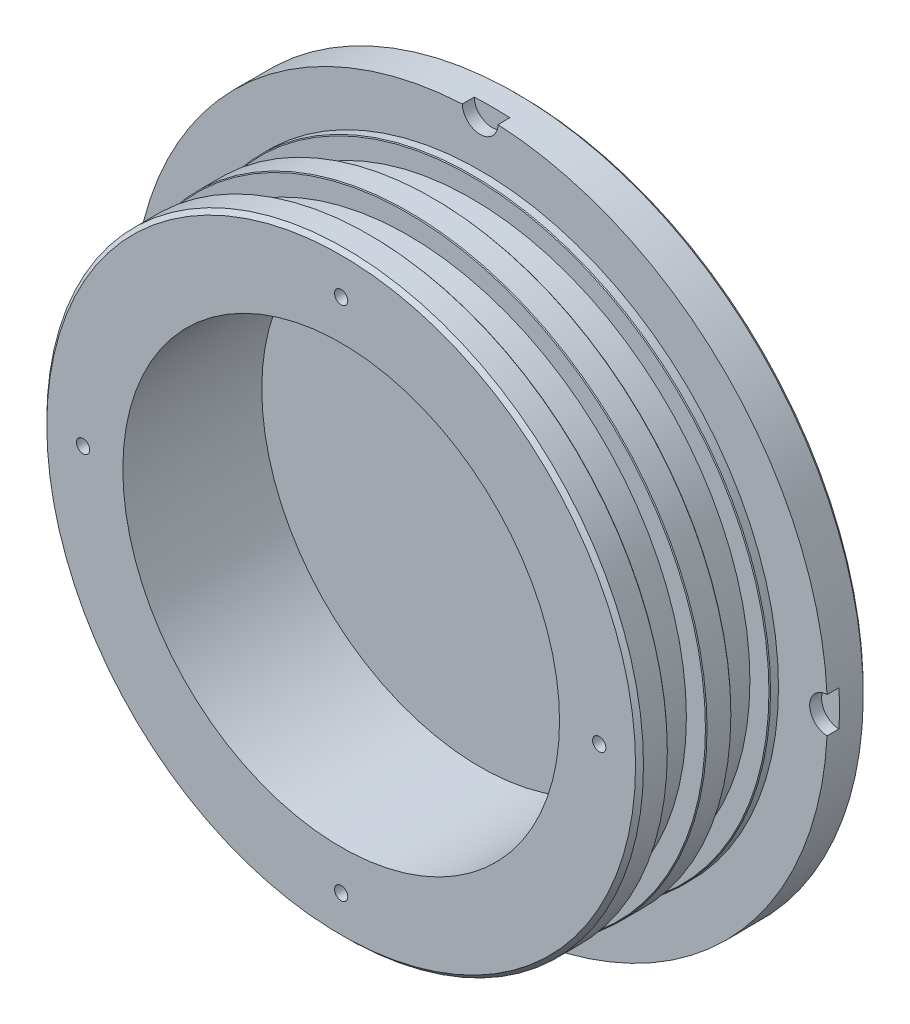
ISO-10303-21;
HEADER;
FILE_DESCRIPTION(('STEP AP214'),'2;1');
FILE_NAME('part.step','',(''),(''),'','','');
FILE_SCHEMA(('AUTOMOTIVE_DESIGN { 1 0 10303 214 1 1 1 1 }'));
ENDSEC;
DATA;
#1=APPLICATION_CONTEXT('core data for automotive mechanical design processes');
#2=APPLICATION_PROTOCOL_DEFINITION('international standard','automotive_design',2000,#1);
#3=PRODUCT_CONTEXT('',#1,'mechanical');
#4=PRODUCT('Part','Part','',(#3));
#5=PRODUCT_RELATED_PRODUCT_CATEGORY('part','',(#4));
#6=PRODUCT_DEFINITION_FORMATION('','',#4);
#7=PRODUCT_DEFINITION_CONTEXT('part definition',#1,'design');
#8=PRODUCT_DEFINITION('design','',#6,#7);
#9=PRODUCT_DEFINITION_SHAPE('','',#8);
#10=(LENGTH_UNIT() NAMED_UNIT(*) SI_UNIT(.MILLI.,.METRE.));
#11=(NAMED_UNIT(*) PLANE_ANGLE_UNIT() SI_UNIT($,.RADIAN.));
#12=(NAMED_UNIT(*) SI_UNIT($,.STERADIAN.) SOLID_ANGLE_UNIT());
#13=UNCERTAINTY_MEASURE_WITH_UNIT(LENGTH_MEASURE(1.E-05),#10,'distance_accuracy_value','');
#14=(GEOMETRIC_REPRESENTATION_CONTEXT(3) GLOBAL_UNCERTAINTY_ASSIGNED_CONTEXT((#13)) GLOBAL_UNIT_ASSIGNED_CONTEXT((#10,
#11,#12)) REPRESENTATION_CONTEXT('',''));
#15=CARTESIAN_POINT('',(0.,0.,0.));
#16=DIRECTION('',(0.,0.,1.));
#17=DIRECTION('',(1.,0.,0.));
#18=AXIS2_PLACEMENT_3D('',#15,#16,#17);
#19=CARTESIAN_POINT('',(0.,0.,-159.225));
#20=DIRECTION('',(0.,0.,1.));
#21=DIRECTION('',(1.,0.,0.));
#22=AXIS2_PLACEMENT_3D('',#19,#20,#21);
#23=CYLINDRICAL_SURFACE('',#22,87.5);
#24=CARTESIAN_POINT('',(0.,0.,-158.225));
#25=DIRECTION('',(0.,0.,-1.));
#26=DIRECTION('',(-1.,0.,0.));
#27=AXIS2_PLACEMENT_3D('',#24,#25,#26);
#28=CIRCLE('',#27,87.5);
#29=CARTESIAN_POINT('',(-87.5,0.,-158.225));
#30=VERTEX_POINT('',#29);
#31=EDGE_CURVE('E240',#30,#30,#28,.F.);
#32=ORIENTED_EDGE('',*,*,#31,.T.);
#33=EDGE_LOOP('',(#32));
#34=FACE_BOUND('',#33,.T.);
#35=DIRECTION('',(0.,0.,1.));
#36=VECTOR('',#35,1.);
#37=CARTESIAN_POINT('',(-87.3842857142857,-4.49851199888159,-150.725));
#38=LINE('',#37,#36);
#39=CARTESIAN_POINT('',(-87.3842857142857,-4.49851199888159,-152.225));
#40=VERTEX_POINT('',#39);
#41=CARTESIAN_POINT('',(-87.3842857142857,-4.49851199888141,-149.225));
#42=VERTEX_POINT('',#41);
#43=EDGE_CURVE('E54',#40,#42,#38,.T.);
#44=ORIENTED_EDGE('',*,*,#43,.F.);
#45=CARTESIAN_POINT('',(0.,0.,-152.225));
#46=DIRECTION('',(0.,0.,-1.));
#47=DIRECTION('',(-1.,0.,0.));
#48=AXIS2_PLACEMENT_3D('',#45,#46,#47);
#49=CIRCLE('',#48,87.5);
#50=CARTESIAN_POINT('',(-87.3842857142857,4.49851199888155,-152.225));
#51=VERTEX_POINT('',#50);
#52=EDGE_CURVE('E154',#51,#40,#49,.F.);
#53=ORIENTED_EDGE('',*,*,#52,.F.);
#54=DIRECTION('',(0.,0.,1.));
#55=VECTOR('',#54,1.);
#56=CARTESIAN_POINT('',(-87.3842857142857,4.49851199888155,-150.725));
#57=LINE('',#56,#55);
#58=CARTESIAN_POINT('',(-87.3842857142857,4.49851199888155,-149.225));
#59=VERTEX_POINT('',#58);
#60=EDGE_CURVE('E158',#59,#51,#57,.F.);
#61=ORIENTED_EDGE('',*,*,#60,.F.);
#62=CARTESIAN_POINT('',(0.,0.,-149.225));
#63=DIRECTION('',(0.,0.,1.));
#64=DIRECTION('',(1.,0.,0.));
#65=AXIS2_PLACEMENT_3D('',#62,#63,#64);
#66=CIRCLE('',#65,87.5);
#67=CARTESIAN_POINT('',(-4.49851199888139,87.3842857142857,-149.225));
#68=VERTEX_POINT('',#67);
#69=EDGE_CURVE('E190',#68,#59,#66,.T.);
#70=ORIENTED_EDGE('',*,*,#69,.F.);
#71=DIRECTION('',(0.,0.,1.));
#72=VECTOR('',#71,1.);
#73=CARTESIAN_POINT('',(-4.49851199888157,87.3842857142857,-150.725));
#74=LINE('',#73,#72);
#75=CARTESIAN_POINT('',(-4.49851199888157,87.3842857142857,-152.225));
#76=VERTEX_POINT('',#75);
#77=EDGE_CURVE('E62',#76,#68,#74,.T.);
#78=ORIENTED_EDGE('',*,*,#77,.F.);
#79=CARTESIAN_POINT('',(0.,0.,-152.225));
#80=DIRECTION('',(0.,0.,-1.));
#81=DIRECTION('',(-1.,0.,0.));
#82=AXIS2_PLACEMENT_3D('',#79,#80,#81);
#83=CIRCLE('',#82,87.5);
#84=CARTESIAN_POINT('',(4.49851199888157,87.3842857142857,-152.225));
#85=VERTEX_POINT('',#84);
#86=EDGE_CURVE('E155',#85,#76,#83,.F.);
#87=ORIENTED_EDGE('',*,*,#86,.F.);
#88=DIRECTION('',(0.,0.,1.));
#89=VECTOR('',#88,1.);
#90=CARTESIAN_POINT('',(4.49851199888157,87.3842857142857,-150.725));
#91=LINE('',#90,#89);
#92=CARTESIAN_POINT('',(4.49851199888157,87.3842857142857,-149.225));
#93=VERTEX_POINT('',#92);
#94=EDGE_CURVE('E166',#93,#85,#91,.F.);
#95=ORIENTED_EDGE('',*,*,#94,.F.);
#96=CARTESIAN_POINT('',(87.3842857142857,4.49851199888137,-149.225));
#97=VERTEX_POINT('',#96);
#98=EDGE_CURVE('E186',#97,#93,#66,.T.);
#99=ORIENTED_EDGE('',*,*,#98,.F.);
#100=DIRECTION('',(0.,0.,1.));
#101=VECTOR('',#100,1.);
#102=CARTESIAN_POINT('',(87.3842857142857,4.49851199888155,-150.725));
#103=LINE('',#102,#101);
#104=CARTESIAN_POINT('',(87.3842857142857,4.49851199888155,-152.225));
#105=VERTEX_POINT('',#104);
#106=EDGE_CURVE('E183',#105,#97,#103,.T.);
#107=ORIENTED_EDGE('',*,*,#106,.F.);
#108=CARTESIAN_POINT('',(0.,0.,-152.225));
#109=DIRECTION('',(0.,0.,-1.));
#110=DIRECTION('',(-1.,0.,0.));
#111=AXIS2_PLACEMENT_3D('',#108,#109,#110);
#112=CIRCLE('',#111,87.5);
#113=CARTESIAN_POINT('',(87.3842857142857,-4.49851199888159,-152.225));
#114=VERTEX_POINT('',#113);
#115=EDGE_CURVE('E206',#114,#105,#112,.F.);
#116=ORIENTED_EDGE('',*,*,#115,.F.);
#117=DIRECTION('',(0.,0.,1.));
#118=VECTOR('',#117,1.);
#119=CARTESIAN_POINT('',(87.3842857142857,-4.49851199888159,-150.725));
#120=LINE('',#119,#118);
#121=CARTESIAN_POINT('',(87.3842857142857,-4.49851199888159,-149.225));
#122=VERTEX_POINT('',#121);
#123=EDGE_CURVE('E181',#122,#114,#120,.F.);
#124=ORIENTED_EDGE('',*,*,#123,.F.);
#125=CARTESIAN_POINT('',(4.49851199888156,-87.3842857142857,-149.225));
#126=VERTEX_POINT('',#125);
#127=EDGE_CURVE('E185',#126,#122,#66,.T.);
#128=ORIENTED_EDGE('',*,*,#127,.F.);
#129=DIRECTION('',(0.,0.,1.));
#130=VECTOR('',#129,1.);
#131=CARTESIAN_POINT('',(4.49851199888156,-87.3842857142857,-150.725));
#132=LINE('',#131,#130);
#133=CARTESIAN_POINT('',(4.49851199888156,-87.3842857142857,-152.225));
#134=VERTEX_POINT('',#133);
#135=EDGE_CURVE('E212',#134,#126,#132,.T.);
#136=ORIENTED_EDGE('',*,*,#135,.F.);
#137=CARTESIAN_POINT('',(0.,0.,-152.225));
#138=DIRECTION('',(0.,0.,-1.));
#139=DIRECTION('',(-1.,0.,0.));
#140=AXIS2_PLACEMENT_3D('',#137,#138,#139);
#141=CIRCLE('',#140,87.5);
#142=CARTESIAN_POINT('',(-4.49851199888158,-87.3842857142857,-152.225));
#143=VERTEX_POINT('',#142);
#144=EDGE_CURVE('E210',#143,#134,#141,.F.);
#145=ORIENTED_EDGE('',*,*,#144,.F.);
#146=DIRECTION('',(0.,0.,1.));
#147=VECTOR('',#146,1.);
#148=CARTESIAN_POINT('',(-4.49851199888158,-87.3842857142857,-150.725));
#149=LINE('',#148,#147);
#150=CARTESIAN_POINT('',(-4.49851199888158,-87.3842857142857,-149.225));
#151=VERTEX_POINT('',#150);
#152=EDGE_CURVE('E208',#151,#143,#149,.F.);
#153=ORIENTED_EDGE('',*,*,#152,.F.);
#154=EDGE_CURVE('E191',#42,#151,#66,.T.);
#155=ORIENTED_EDGE('',*,*,#154,.F.);
#156=EDGE_LOOP('',(#44,#53,#61,#70,#78,#87,#95,#99,#107,#116,#124,#128,#136,#145,#153,#155));
#157=FACE_BOUND('',#156,.T.);
#158=ADVANCED_FACE('F38',(#34,#157),#23,.T.);
#159=CARTESIAN_POINT('',(87.5,0.,-159.225));
#160=DIRECTION('',(0.,0.,-1.));
#161=DIRECTION('',(-1.,0.,0.));
#162=AXIS2_PLACEMENT_3D('',#159,#160,#161);
#163=PLANE('',#162);
#164=CARTESIAN_POINT('',(0.,0.,-159.225));
#165=DIRECTION('',(0.,0.,-1.));
#166=DIRECTION('',(-1.,0.,0.));
#167=AXIS2_PLACEMENT_3D('',#164,#165,#166);
#168=CIRCLE('',#167,86.5);
#169=CARTESIAN_POINT('',(-86.5,0.,-159.225));
#170=VERTEX_POINT('',#169);
#171=EDGE_CURVE('E243',#170,#170,#168,.T.);
#172=ORIENTED_EDGE('',*,*,#171,.T.);
#173=EDGE_LOOP('',(#172));
#174=FACE_BOUND('',#173,.T.);
#175=ADVANCED_FACE('F261',(#174),#163,.T.);
#176=CARTESIAN_POINT('',(0.,0.,-114.225));
#177=DIRECTION('',(0.,0.,1.));
#178=DIRECTION('',(1.,0.,0.));
#179=AXIS2_PLACEMENT_3D('',#176,#177,#178);
#180=PLANE('',#179);
#181=CARTESIAN_POINT('',(0.,0.,-114.225));
#182=DIRECTION('',(0.,0.,1.));
#183=DIRECTION('',(1.,0.,0.));
#184=AXIS2_PLACEMENT_3D('',#181,#182,#183);
#185=CIRCLE('',#184,74.15);
#186=CARTESIAN_POINT('',(74.15,0.,-114.225));
#187=VERTEX_POINT('',#186);
#188=EDGE_CURVE('E47',#187,#187,#185,.T.);
#189=ORIENTED_EDGE('',*,*,#188,.T.);
#190=EDGE_LOOP('',(#189));
#191=FACE_BOUND('',#190,.T.);
#192=CARTESIAN_POINT('',(0.,0.,-114.225));
#193=DIRECTION('',(0.,0.,1.));
#194=DIRECTION('',(1.,0.,0.));
#195=AXIS2_PLACEMENT_3D('',#192,#193,#194);
#196=CIRCLE('',#195,55.);
#197=CARTESIAN_POINT('',(55.,0.,-114.225));
#198=VERTEX_POINT('',#197);
#199=EDGE_CURVE('E676',#198,#198,#196,.T.);
#200=ORIENTED_EDGE('',*,*,#199,.F.);
#201=EDGE_LOOP('',(#200));
#202=FACE_BOUND('',#201,.T.);
#203=CARTESIAN_POINT('',(-65.,0.,-114.225));
#204=DIRECTION('',(0.,0.,1.));
#205=DIRECTION('',(1.,0.,0.));
#206=AXIS2_PLACEMENT_3D('',#203,#204,#205);
#207=CIRCLE('',#206,1.66599999999999);
#208=CARTESIAN_POINT('',(-63.334,0.,-114.225));
#209=VERTEX_POINT('',#208);
#210=EDGE_CURVE('E127',#209,#209,#207,.T.);
#211=ORIENTED_EDGE('',*,*,#210,.F.);
#212=EDGE_LOOP('',(#211));
#213=FACE_BOUND('',#212,.T.);
#214=CARTESIAN_POINT('',(65.,0.,-114.225));
#215=DIRECTION('',(0.,0.,1.));
#216=DIRECTION('',(1.,0.,0.));
#217=AXIS2_PLACEMENT_3D('',#214,#215,#216);
#218=CIRCLE('',#217,1.66599999999999);
#219=CARTESIAN_POINT('',(66.666,0.,-114.225));
#220=VERTEX_POINT('',#219);
#221=EDGE_CURVE('E126',#220,#220,#218,.T.);
#222=ORIENTED_EDGE('',*,*,#221,.F.);
#223=EDGE_LOOP('',(#222));
#224=FACE_BOUND('',#223,.T.);
#225=CARTESIAN_POINT('',(0.,65.,-114.225));
#226=DIRECTION('',(0.,0.,1.));
#227=DIRECTION('',(1.,0.,0.));
#228=AXIS2_PLACEMENT_3D('',#225,#226,#227);
#229=CIRCLE('',#228,1.66599999999999);
#230=CARTESIAN_POINT('',(1.66599999999999,65.,-114.225));
#231=VERTEX_POINT('',#230);
#232=EDGE_CURVE('E139',#231,#231,#229,.T.);
#233=ORIENTED_EDGE('',*,*,#232,.F.);
#234=EDGE_LOOP('',(#233));
#235=FACE_BOUND('',#234,.T.);
#236=CARTESIAN_POINT('',(0.,-65.,-114.225));
#237=DIRECTION('',(0.,0.,1.));
#238=DIRECTION('',(1.,0.,0.));
#239=AXIS2_PLACEMENT_3D('',#236,#237,#238);
#240=CIRCLE('',#239,1.66599999999999);
#241=CARTESIAN_POINT('',(1.66599999999999,-65.,-114.225));
#242=VERTEX_POINT('',#241);
#243=EDGE_CURVE('E145',#242,#242,#240,.T.);
#244=ORIENTED_EDGE('',*,*,#243,.F.);
#245=EDGE_LOOP('',(#244));
#246=FACE_BOUND('',#245,.T.);
#247=ADVANCED_FACE('F248',(#191,#202,#213,#224,#235,#246),#180,.T.);
#248=CARTESIAN_POINT('',(0.,0.,-159.225));
#249=DIRECTION('',(0.,0.,1.));
#250=DIRECTION('',(1.,0.,0.));
#251=AXIS2_PLACEMENT_3D('',#248,#249,#250);
#252=CYLINDRICAL_SURFACE('',#251,75.15);
#253=CARTESIAN_POINT('',(0.,0.,-115.225));
#254=DIRECTION('',(0.,0.,1.));
#255=DIRECTION('',(1.,0.,0.));
#256=AXIS2_PLACEMENT_3D('',#253,#254,#255);
#257=CIRCLE('',#256,75.15);
#258=CARTESIAN_POINT('',(75.15,0.,-115.225));
#259=VERTEX_POINT('',#258);
#260=EDGE_CURVE('E11',#259,#259,#257,.F.);
#261=ORIENTED_EDGE('',*,*,#260,.T.);
#262=EDGE_LOOP('',(#261));
#263=FACE_BOUND('',#262,.T.);
#264=CARTESIAN_POINT('',(0.,0.,-121.225));
#265=DIRECTION('',(0.,0.,-1.));
#266=DIRECTION('',(-1.,0.,0.));
#267=AXIS2_PLACEMENT_3D('',#264,#265,#266);
#268=CIRCLE('',#267,75.15);
#269=CARTESIAN_POINT('',(-75.15,0.,-121.225));
#270=VERTEX_POINT('',#269);
#271=EDGE_CURVE('E222',#270,#270,#268,.F.);
#272=ORIENTED_EDGE('',*,*,#271,.T.);
#273=EDGE_LOOP('',(#272));
#274=FACE_BOUND('',#273,.T.);
#275=ADVANCED_FACE('F334',(#263,#274),#252,.T.);
#276=CARTESIAN_POINT('',(75.15,0.,-121.425));
#277=DIRECTION('',(0.,0.,-1.));
#278=DIRECTION('',(-1.,0.,0.));
#279=AXIS2_PLACEMENT_3D('',#276,#277,#278);
#280=PLANE('',#279);
#281=CARTESIAN_POINT('',(0.,0.,-121.425));
#282=DIRECTION('',(0.,0.,-1.));
#283=DIRECTION('',(-1.,0.,0.));
#284=AXIS2_PLACEMENT_3D('',#281,#282,#283);
#285=CIRCLE('',#284,74.95);
#286=CARTESIAN_POINT('',(-74.95,0.,-121.425));
#287=VERTEX_POINT('',#286);
#288=EDGE_CURVE('E225',#287,#287,#285,.T.);
#289=ORIENTED_EDGE('',*,*,#288,.T.);
#290=EDGE_LOOP('',(#289));
#291=FACE_BOUND('',#290,.T.);
#292=CARTESIAN_POINT('',(0.,0.,-121.425));
#293=DIRECTION('',(0.,0.,1.));
#294=DIRECTION('',(1.,0.,0.));
#295=AXIS2_PLACEMENT_3D('',#292,#293,#294);
#296=CIRCLE('',#295,70.15);
#297=CARTESIAN_POINT('',(70.15,0.,-121.425));
#298=VERTEX_POINT('',#297);
#299=EDGE_CURVE('E203',#298,#298,#296,.T.);
#300=ORIENTED_EDGE('',*,*,#299,.T.);
#301=EDGE_LOOP('',(#300));
#302=FACE_BOUND('',#301,.T.);
#303=ADVANCED_FACE('F330',(#291,#302),#280,.T.);
#304=CARTESIAN_POINT('',(0.,0.,-159.225));
#305=DIRECTION('',(0.,0.,1.));
#306=DIRECTION('',(1.,0.,0.));
#307=AXIS2_PLACEMENT_3D('',#304,#305,#306);
#308=CYLINDRICAL_SURFACE('',#307,70.15);
#309=CARTESIAN_POINT('',(0.,0.,-131.025));
#310=DIRECTION('',(0.,0.,1.));
#311=DIRECTION('',(1.,0.,0.));
#312=AXIS2_PLACEMENT_3D('',#309,#310,#311);
#313=CIRCLE('',#312,70.15);
#314=CARTESIAN_POINT('',(70.15,0.,-131.025));
#315=VERTEX_POINT('',#314);
#316=EDGE_CURVE('E200',#315,#315,#313,.T.);
#317=ORIENTED_EDGE('',*,*,#316,.T.);
#318=EDGE_LOOP('',(#317));
#319=FACE_BOUND('',#318,.T.);
#320=ORIENTED_EDGE('',*,*,#299,.F.);
#321=EDGE_LOOP('',(#320));
#322=FACE_BOUND('',#321,.T.);
#323=ADVANCED_FACE('F323',(#319,#322),#308,.T.);
#324=CARTESIAN_POINT('',(70.15,0.,-131.025));
#325=DIRECTION('',(0.,0.,1.));
#326=DIRECTION('',(1.,0.,0.));
#327=AXIS2_PLACEMENT_3D('',#324,#325,#326);
#328=PLANE('',#327);
#329=CARTESIAN_POINT('',(0.,0.,-131.025));
#330=DIRECTION('',(0.,0.,1.));
#331=DIRECTION('',(1.,0.,0.));
#332=AXIS2_PLACEMENT_3D('',#329,#330,#331);
#333=CIRCLE('',#332,74.9500000000001);
#334=CARTESIAN_POINT('',(-74.9500000000001,0.,-131.025));
#335=VERTEX_POINT('',#334);
#336=EDGE_CURVE('E228',#335,#335,#333,.T.);
#337=ORIENTED_EDGE('',*,*,#336,.T.);
#338=EDGE_LOOP('',(#337));
#339=FACE_BOUND('',#338,.T.);
#340=ORIENTED_EDGE('',*,*,#316,.F.);
#341=EDGE_LOOP('',(#340));
#342=FACE_BOUND('',#341,.T.);
#343=ADVANCED_FACE('F313',(#339,#342),#328,.T.);
#344=CARTESIAN_POINT('',(0.,0.,-159.225));
#345=DIRECTION('',(0.,0.,1.));
#346=DIRECTION('',(1.,0.,0.));
#347=AXIS2_PLACEMENT_3D('',#344,#345,#346);
#348=CYLINDRICAL_SURFACE('',#347,75.15);
#349=CARTESIAN_POINT('',(0.,0.,-131.225));
#350=DIRECTION('',(0.,0.,1.));
#351=DIRECTION('',(1.,0.,0.));
#352=AXIS2_PLACEMENT_3D('',#349,#350,#351);
#353=CIRCLE('',#352,75.15);
#354=CARTESIAN_POINT('',(-75.15,0.,-131.225));
#355=VERTEX_POINT('',#354);
#356=EDGE_CURVE('E234',#355,#355,#353,.F.);
#357=ORIENTED_EDGE('',*,*,#356,.T.);
#358=EDGE_LOOP('',(#357));
#359=FACE_BOUND('',#358,.T.);
#360=CARTESIAN_POINT('',(0.,0.,-137.225));
#361=DIRECTION('',(0.,0.,-1.));
#362=DIRECTION('',(-1.,0.,0.));
#363=AXIS2_PLACEMENT_3D('',#360,#361,#362);
#364=CIRCLE('',#363,75.15);
#365=CARTESIAN_POINT('',(-75.15,0.,-137.225));
#366=VERTEX_POINT('',#365);
#367=EDGE_CURVE('E231',#366,#366,#364,.F.);
#368=ORIENTED_EDGE('',*,*,#367,.T.);
#369=EDGE_LOOP('',(#368));
#370=FACE_BOUND('',#369,.T.);
#371=ADVANCED_FACE('F310',(#359,#370),#348,.T.);
#372=CARTESIAN_POINT('',(75.15,0.,-137.425));
#373=DIRECTION('',(0.,0.,-1.));
#374=DIRECTION('',(-1.,0.,0.));
#375=AXIS2_PLACEMENT_3D('',#372,#373,#374);
#376=PLANE('',#375);
#377=CARTESIAN_POINT('',(0.,0.,-137.425));
#378=DIRECTION('',(0.,0.,-1.));
#379=DIRECTION('',(-1.,0.,0.));
#380=AXIS2_PLACEMENT_3D('',#377,#378,#379);
#381=CIRCLE('',#380,74.95);
#382=CARTESIAN_POINT('',(-74.95,0.,-137.425));
#383=VERTEX_POINT('',#382);
#384=EDGE_CURVE('E237',#383,#383,#381,.T.);
#385=ORIENTED_EDGE('',*,*,#384,.T.);
#386=EDGE_LOOP('',(#385));
#387=FACE_BOUND('',#386,.T.);
#388=CARTESIAN_POINT('',(0.,0.,-137.425));
#389=DIRECTION('',(0.,0.,1.));
#390=DIRECTION('',(1.,0.,0.));
#391=AXIS2_PLACEMENT_3D('',#388,#389,#390);
#392=CIRCLE('',#391,70.15);
#393=CARTESIAN_POINT('',(70.15,0.,-137.425));
#394=VERTEX_POINT('',#393);
#395=EDGE_CURVE('E197',#394,#394,#392,.T.);
#396=ORIENTED_EDGE('',*,*,#395,.T.);
#397=EDGE_LOOP('',(#396));
#398=FACE_BOUND('',#397,.T.);
#399=ADVANCED_FACE('F312',(#387,#398),#376,.T.);
#400=CARTESIAN_POINT('',(0.,0.,-159.225));
#401=DIRECTION('',(0.,0.,1.));
#402=DIRECTION('',(1.,0.,0.));
#403=AXIS2_PLACEMENT_3D('',#400,#401,#402);
#404=CYLINDRICAL_SURFACE('',#403,70.15);
#405=CARTESIAN_POINT('',(0.,0.,-147.025));
#406=DIRECTION('',(0.,0.,1.));
#407=DIRECTION('',(1.,0.,0.));
#408=AXIS2_PLACEMENT_3D('',#405,#406,#407);
#409=CIRCLE('',#408,70.15);
#410=CARTESIAN_POINT('',(70.15,0.,-147.025));
#411=VERTEX_POINT('',#410);
#412=EDGE_CURVE('E194',#411,#411,#409,.T.);
#413=ORIENTED_EDGE('',*,*,#412,.T.);
#414=EDGE_LOOP('',(#413));
#415=FACE_BOUND('',#414,.T.);
#416=ORIENTED_EDGE('',*,*,#395,.F.);
#417=EDGE_LOOP('',(#416));
#418=FACE_BOUND('',#417,.T.);
#419=ADVANCED_FACE('F320',(#415,#418),#404,.T.);
#420=CARTESIAN_POINT('',(70.15,0.,-147.025));
#421=DIRECTION('',(0.,0.,1.));
#422=DIRECTION('',(1.,0.,0.));
#423=AXIS2_PLACEMENT_3D('',#420,#421,#422);
#424=PLANE('',#423);
#425=CARTESIAN_POINT('',(0.,0.,-147.025));
#426=DIRECTION('',(0.,0.,1.));
#427=DIRECTION('',(1.,0.,0.));
#428=AXIS2_PLACEMENT_3D('',#425,#426,#427);
#429=CIRCLE('',#428,74.95);
#430=CARTESIAN_POINT('',(-74.9500000000001,0.,-147.025));
#431=VERTEX_POINT('',#430);
#432=EDGE_CURVE('E216',#431,#431,#429,.T.);
#433=ORIENTED_EDGE('',*,*,#432,.T.);
#434=EDGE_LOOP('',(#433));
#435=FACE_BOUND('',#434,.T.);
#436=ORIENTED_EDGE('',*,*,#412,.F.);
#437=EDGE_LOOP('',(#436));
#438=FACE_BOUND('',#437,.T.);
#439=ADVANCED_FACE('F379',(#435,#438),#424,.T.);
#440=CARTESIAN_POINT('',(0.,0.,-159.225));
#441=DIRECTION('',(0.,0.,1.));
#442=DIRECTION('',(1.,0.,0.));
#443=AXIS2_PLACEMENT_3D('',#440,#441,#442);
#444=CYLINDRICAL_SURFACE('',#443,75.15);
#445=CARTESIAN_POINT('',(0.,0.,-147.225));
#446=DIRECTION('',(0.,0.,1.));
#447=DIRECTION('',(1.,0.,0.));
#448=AXIS2_PLACEMENT_3D('',#445,#446,#447);
#449=CIRCLE('',#448,75.15);
#450=CARTESIAN_POINT('',(-75.15,0.,-147.225));
#451=VERTEX_POINT('',#450);
#452=EDGE_CURVE('E219',#451,#451,#449,.F.);
#453=ORIENTED_EDGE('',*,*,#452,.T.);
#454=EDGE_LOOP('',(#453));
#455=FACE_BOUND('',#454,.T.);
#456=CARTESIAN_POINT('',(0.,0.,-149.225));
#457=DIRECTION('',(0.,0.,1.));
#458=DIRECTION('',(1.,0.,0.));
#459=AXIS2_PLACEMENT_3D('',#456,#457,#458);
#460=CIRCLE('',#459,75.15);
#461=CARTESIAN_POINT('',(75.15,0.,-149.225));
#462=VERTEX_POINT('',#461);
#463=EDGE_CURVE('E189',#462,#462,#460,.T.);
#464=ORIENTED_EDGE('',*,*,#463,.T.);
#465=EDGE_LOOP('',(#464));
#466=FACE_BOUND('',#465,.T.);
#467=ADVANCED_FACE('F384',(#455,#466),#444,.T.);
#468=CARTESIAN_POINT('',(75.15,0.,-149.225));
#469=DIRECTION('',(0.,0.,1.));
#470=DIRECTION('',(1.,0.,0.));
#471=AXIS2_PLACEMENT_3D('',#468,#469,#470);
#472=PLANE('',#471);
#473=CARTESIAN_POINT('',(-87.5,0.,-149.225));
#474=DIRECTION('',(0.,0.,1.));
#475=DIRECTION('',(1.,0.,0.));
#476=AXIS2_PLACEMENT_3D('',#473,#474,#475);
#477=CIRCLE('',#476,4.49999999999998);
#478=EDGE_CURVE('E152',#42,#59,#477,.T.);
#479=ORIENTED_EDGE('',*,*,#478,.F.);
#480=ORIENTED_EDGE('',*,*,#154,.T.);
#481=CARTESIAN_POINT('',(0.,-87.5,-149.225));
#482=DIRECTION('',(0.,0.,1.));
#483=DIRECTION('',(1.,0.,0.));
#484=AXIS2_PLACEMENT_3D('',#481,#482,#483);
#485=CIRCLE('',#484,4.49999999999998);
#486=EDGE_CURVE('E169',#126,#151,#485,.T.);
#487=ORIENTED_EDGE('',*,*,#486,.F.);
#488=ORIENTED_EDGE('',*,*,#127,.T.);
#489=CARTESIAN_POINT('',(87.5,0.,-149.225));
#490=DIRECTION('',(0.,0.,1.));
#491=DIRECTION('',(1.,0.,0.));
#492=AXIS2_PLACEMENT_3D('',#489,#490,#491);
#493=CIRCLE('',#492,4.49999999999998);
#494=EDGE_CURVE('E175',#97,#122,#493,.T.);
#495=ORIENTED_EDGE('',*,*,#494,.F.);
#496=ORIENTED_EDGE('',*,*,#98,.T.);
#497=CARTESIAN_POINT('',(0.,87.5,-149.225));
#498=DIRECTION('',(0.,0.,1.));
#499=DIRECTION('',(1.,0.,0.));
#500=AXIS2_PLACEMENT_3D('',#497,#498,#499);
#501=CIRCLE('',#500,4.49999999999998);
#502=EDGE_CURVE('E161',#68,#93,#501,.T.);
#503=ORIENTED_EDGE('',*,*,#502,.F.);
#504=ORIENTED_EDGE('',*,*,#69,.T.);
#505=EDGE_LOOP('',(#479,#480,#487,#488,#495,#496,#503,#504));
#506=FACE_BOUND('',#505,.T.);
#507=ORIENTED_EDGE('',*,*,#463,.F.);
#508=EDGE_LOOP('',(#507));
#509=FACE_BOUND('',#508,.T.);
#510=ADVANCED_FACE('F394',(#506,#509),#472,.T.);
#511=CARTESIAN_POINT('',(87.5,0.,-152.225));
#512=DIRECTION('',(0.,0.,-1.));
#513=DIRECTION('',(-1.,0.,0.));
#514=AXIS2_PLACEMENT_3D('',#511,#512,#513);
#515=PLANE('',#514);
#516=ORIENTED_EDGE('',*,*,#115,.T.);
#517=CARTESIAN_POINT('',(87.5,0.,-152.225));
#518=DIRECTION('',(0.,0.,1.));
#519=DIRECTION('',(1.,0.,0.));
#520=AXIS2_PLACEMENT_3D('',#517,#518,#519);
#521=CIRCLE('',#520,4.49999999999998);
#522=EDGE_CURVE('E178',#105,#114,#521,.T.);
#523=ORIENTED_EDGE('',*,*,#522,.T.);
#524=EDGE_LOOP('',(#516,#523));
#525=FACE_BOUND('',#524,.T.);
#526=ADVANCED_FACE('F570',(#525),#515,.F.);
#527=CARTESIAN_POINT('',(87.5,0.,-149.225));
#528=DIRECTION('',(0.,0.,1.));
#529=DIRECTION('',(1.,0.,0.));
#530=AXIS2_PLACEMENT_3D('',#527,#528,#529);
#531=CYLINDRICAL_SURFACE('',#530,4.49999999999998);
#532=ORIENTED_EDGE('',*,*,#106,.T.);
#533=ORIENTED_EDGE('',*,*,#494,.T.);
#534=ORIENTED_EDGE('',*,*,#123,.T.);
#535=ORIENTED_EDGE('',*,*,#522,.F.);
#536=EDGE_LOOP('',(#532,#533,#534,#535));
#537=FACE_BOUND('',#536,.T.);
#538=ADVANCED_FACE('F562',(#537),#531,.F.);
#539=CARTESIAN_POINT('',(0.,-87.5,-152.225));
#540=DIRECTION('',(0.,0.,-1.));
#541=DIRECTION('',(-1.,0.,0.));
#542=AXIS2_PLACEMENT_3D('',#539,#540,#541);
#543=PLANE('',#542);
#544=ORIENTED_EDGE('',*,*,#144,.T.);
#545=CARTESIAN_POINT('',(0.,-87.5,-152.225));
#546=DIRECTION('',(0.,0.,1.));
#547=DIRECTION('',(1.,0.,0.));
#548=AXIS2_PLACEMENT_3D('',#545,#546,#547);
#549=CIRCLE('',#548,4.49999999999998);
#550=EDGE_CURVE('E172',#134,#143,#549,.T.);
#551=ORIENTED_EDGE('',*,*,#550,.T.);
#552=EDGE_LOOP('',(#544,#551));
#553=FACE_BOUND('',#552,.T.);
#554=ADVANCED_FACE('F554',(#553),#543,.F.);
#555=CARTESIAN_POINT('',(0.,-87.5,-149.225));
#556=DIRECTION('',(0.,0.,1.));
#557=DIRECTION('',(1.,0.,0.));
#558=AXIS2_PLACEMENT_3D('',#555,#556,#557);
#559=CYLINDRICAL_SURFACE('',#558,4.49999999999998);
#560=ORIENTED_EDGE('',*,*,#135,.T.);
#561=ORIENTED_EDGE('',*,*,#486,.T.);
#562=ORIENTED_EDGE('',*,*,#152,.T.);
#563=ORIENTED_EDGE('',*,*,#550,.F.);
#564=EDGE_LOOP('',(#560,#561,#562,#563));
#565=FACE_BOUND('',#564,.T.);
#566=ADVANCED_FACE('F546',(#565),#559,.F.);
#567=CARTESIAN_POINT('',(0.,87.5,-152.225));
#568=DIRECTION('',(0.,0.,-1.));
#569=DIRECTION('',(-1.,0.,0.));
#570=AXIS2_PLACEMENT_3D('',#567,#568,#569);
#571=PLANE('',#570);
#572=ORIENTED_EDGE('',*,*,#86,.T.);
#573=CARTESIAN_POINT('',(0.,87.5,-152.225));
#574=DIRECTION('',(0.,0.,1.));
#575=DIRECTION('',(1.,0.,0.));
#576=AXIS2_PLACEMENT_3D('',#573,#574,#575);
#577=CIRCLE('',#576,4.49999999999998);
#578=EDGE_CURVE('E163',#76,#85,#577,.T.);
#579=ORIENTED_EDGE('',*,*,#578,.T.);
#580=EDGE_LOOP('',(#572,#579));
#581=FACE_BOUND('',#580,.T.);
#582=ADVANCED_FACE('F539',(#581),#571,.F.);
#583=CARTESIAN_POINT('',(0.,87.5,-149.225));
#584=DIRECTION('',(0.,0.,1.));
#585=DIRECTION('',(1.,0.,0.));
#586=AXIS2_PLACEMENT_3D('',#583,#584,#585);
#587=CYLINDRICAL_SURFACE('',#586,4.49999999999998);
#588=ORIENTED_EDGE('',*,*,#77,.T.);
#589=ORIENTED_EDGE('',*,*,#502,.T.);
#590=ORIENTED_EDGE('',*,*,#94,.T.);
#591=ORIENTED_EDGE('',*,*,#578,.F.);
#592=EDGE_LOOP('',(#588,#589,#590,#591));
#593=FACE_BOUND('',#592,.T.);
#594=ADVANCED_FACE('F531',(#593),#587,.F.);
#595=CARTESIAN_POINT('',(-87.5,0.,-152.225));
#596=DIRECTION('',(0.,0.,-1.));
#597=DIRECTION('',(-1.,0.,0.));
#598=AXIS2_PLACEMENT_3D('',#595,#596,#597);
#599=PLANE('',#598);
#600=ORIENTED_EDGE('',*,*,#52,.T.);
#601=CARTESIAN_POINT('',(-87.5,0.,-152.225));
#602=DIRECTION('',(0.,0.,1.));
#603=DIRECTION('',(1.,0.,0.));
#604=AXIS2_PLACEMENT_3D('',#601,#602,#603);
#605=CIRCLE('',#604,4.49999999999998);
#606=EDGE_CURVE('E151',#40,#51,#605,.T.);
#607=ORIENTED_EDGE('',*,*,#606,.T.);
#608=EDGE_LOOP('',(#600,#607));
#609=FACE_BOUND('',#608,.T.);
#610=ADVANCED_FACE('F524',(#609),#599,.F.);
#611=CARTESIAN_POINT('',(-87.5,0.,-149.225));
#612=DIRECTION('',(0.,0.,1.));
#613=DIRECTION('',(1.,0.,0.));
#614=AXIS2_PLACEMENT_3D('',#611,#612,#613);
#615=CYLINDRICAL_SURFACE('',#614,4.49999999999998);
#616=ORIENTED_EDGE('',*,*,#43,.T.);
#617=ORIENTED_EDGE('',*,*,#478,.T.);
#618=ORIENTED_EDGE('',*,*,#60,.T.);
#619=ORIENTED_EDGE('',*,*,#606,.F.);
#620=EDGE_LOOP('',(#616,#617,#618,#619));
#621=FACE_BOUND('',#620,.T.);
#622=ADVANCED_FACE('F516',(#621),#615,.F.);
#623=CARTESIAN_POINT('',(0.,-65.,-130.225));
#624=DIRECTION('',(0.,0.,1.));
#625=DIRECTION('',(1.,0.,0.));
#626=AXIS2_PLACEMENT_3D('',#623,#624,#625);
#627=CONICAL_SURFACE('',#626,1.66599999999999,1.02974425867664);
#628=CARTESIAN_POINT('',(0.,-65.,-131.2260337913));
#629=VERTEX_POINT('',#628);
#630=VERTEX_LOOP('',#629);
#631=FACE_BOUND('',#630,.T.);
#632=CARTESIAN_POINT('',(0.,-65.,-130.225));
#633=DIRECTION('',(0.,0.,1.));
#634=DIRECTION('',(1.,0.,0.));
#635=AXIS2_PLACEMENT_3D('',#632,#633,#634);
#636=CIRCLE('',#635,1.66599999999999);
#637=CARTESIAN_POINT('',(1.66599999999999,-65.,-130.225));
#638=VERTEX_POINT('',#637);
#639=EDGE_CURVE('E148',#638,#638,#636,.T.);
#640=ORIENTED_EDGE('',*,*,#639,.T.);
#641=EDGE_LOOP('',(#640));
#642=FACE_BOUND('',#641,.T.);
#643=ADVANCED_FACE('F508',(#631,#642),#627,.F.);
#644=CARTESIAN_POINT('',(0.,-65.,-114.225));
#645=DIRECTION('',(0.,0.,1.));
#646=DIRECTION('',(1.,0.,0.));
#647=AXIS2_PLACEMENT_3D('',#644,#645,#646);
#648=CYLINDRICAL_SURFACE('',#647,1.66599999999999);
#649=ORIENTED_EDGE('',*,*,#639,.F.);
#650=EDGE_LOOP('',(#649));
#651=FACE_BOUND('',#650,.T.);
#652=ORIENTED_EDGE('',*,*,#243,.T.);
#653=EDGE_LOOP('',(#652));
#654=FACE_BOUND('',#653,.T.);
#655=ADVANCED_FACE('F500',(#651,#654),#648,.F.);
#656=CARTESIAN_POINT('',(0.,65.,-130.225));
#657=DIRECTION('',(0.,0.,1.));
#658=DIRECTION('',(1.,0.,0.));
#659=AXIS2_PLACEMENT_3D('',#656,#657,#658);
#660=CONICAL_SURFACE('',#659,1.66599999999999,1.02974425867664);
#661=CARTESIAN_POINT('',(0.,65.,-131.2260337913));
#662=VERTEX_POINT('',#661);
#663=VERTEX_LOOP('',#662);
#664=FACE_BOUND('',#663,.T.);
#665=CARTESIAN_POINT('',(0.,65.,-130.225));
#666=DIRECTION('',(0.,0.,1.));
#667=DIRECTION('',(1.,0.,0.));
#668=AXIS2_PLACEMENT_3D('',#665,#666,#667);
#669=CIRCLE('',#668,1.66599999999999);
#670=CARTESIAN_POINT('',(1.66599999999999,65.,-130.225));
#671=VERTEX_POINT('',#670);
#672=EDGE_CURVE('E142',#671,#671,#669,.T.);
#673=ORIENTED_EDGE('',*,*,#672,.T.);
#674=EDGE_LOOP('',(#673));
#675=FACE_BOUND('',#674,.T.);
#676=ADVANCED_FACE('F492',(#664,#675),#660,.F.);
#677=CARTESIAN_POINT('',(0.,65.,-114.225));
#678=DIRECTION('',(0.,0.,1.));
#679=DIRECTION('',(1.,0.,0.));
#680=AXIS2_PLACEMENT_3D('',#677,#678,#679);
#681=CYLINDRICAL_SURFACE('',#680,1.66599999999999);
#682=ORIENTED_EDGE('',*,*,#672,.F.);
#683=EDGE_LOOP('',(#682));
#684=FACE_BOUND('',#683,.T.);
#685=ORIENTED_EDGE('',*,*,#232,.T.);
#686=EDGE_LOOP('',(#685));
#687=FACE_BOUND('',#686,.T.);
#688=ADVANCED_FACE('F484',(#684,#687),#681,.F.);
#689=CARTESIAN_POINT('',(65.,0.,-130.225));
#690=DIRECTION('',(0.,0.,1.));
#691=DIRECTION('',(1.,0.,0.));
#692=AXIS2_PLACEMENT_3D('',#689,#690,#691);
#693=CONICAL_SURFACE('',#692,1.66599999999999,1.02974425867665);
#694=CARTESIAN_POINT('',(65.,0.,-131.2260337913));
#695=VERTEX_POINT('',#694);
#696=VERTEX_LOOP('',#695);
#697=FACE_BOUND('',#696,.T.);
#698=CARTESIAN_POINT('',(65.,0.,-130.225));
#699=DIRECTION('',(0.,0.,1.));
#700=DIRECTION('',(1.,0.,0.));
#701=AXIS2_PLACEMENT_3D('',#698,#699,#700);
#702=CIRCLE('',#701,1.66599999999999);
#703=CARTESIAN_POINT('',(66.666,0.,-130.225));
#704=VERTEX_POINT('',#703);
#705=EDGE_CURVE('E130',#704,#704,#702,.T.);
#706=ORIENTED_EDGE('',*,*,#705,.T.);
#707=EDGE_LOOP('',(#706));
#708=FACE_BOUND('',#707,.T.);
#709=ADVANCED_FACE('F476',(#697,#708),#693,.F.);
#710=CARTESIAN_POINT('',(65.,0.,-114.225));
#711=DIRECTION('',(0.,0.,1.));
#712=DIRECTION('',(1.,0.,0.));
#713=AXIS2_PLACEMENT_3D('',#710,#711,#712);
#714=CYLINDRICAL_SURFACE('',#713,1.66599999999999);
#715=ORIENTED_EDGE('',*,*,#705,.F.);
#716=EDGE_LOOP('',(#715));
#717=FACE_BOUND('',#716,.T.);
#718=ORIENTED_EDGE('',*,*,#221,.T.);
#719=EDGE_LOOP('',(#718));
#720=FACE_BOUND('',#719,.T.);
#721=ADVANCED_FACE('F120',(#717,#720),#714,.F.);
#722=CARTESIAN_POINT('',(-65.,0.,-130.225));
#723=DIRECTION('',(0.,0.,1.));
#724=DIRECTION('',(1.,0.,0.));
#725=AXIS2_PLACEMENT_3D('',#722,#723,#724);
#726=CONICAL_SURFACE('',#725,1.66599999999999,1.02974425867665);
#727=CARTESIAN_POINT('',(-65.,0.,-131.2260337913));
#728=VERTEX_POINT('',#727);
#729=VERTEX_LOOP('',#728);
#730=FACE_BOUND('',#729,.T.);
#731=CARTESIAN_POINT('',(-65.,0.,-130.225));
#732=DIRECTION('',(0.,0.,1.));
#733=DIRECTION('',(1.,0.,0.));
#734=AXIS2_PLACEMENT_3D('',#731,#732,#733);
#735=CIRCLE('',#734,1.66599999999999);
#736=CARTESIAN_POINT('',(-63.334,0.,-130.225));
#737=VERTEX_POINT('',#736);
#738=EDGE_CURVE('E124',#737,#737,#735,.T.);
#739=ORIENTED_EDGE('',*,*,#738,.T.);
#740=EDGE_LOOP('',(#739));
#741=FACE_BOUND('',#740,.T.);
#742=ADVANCED_FACE('F116',(#730,#741),#726,.F.);
#743=CARTESIAN_POINT('',(-65.,0.,-114.225));
#744=DIRECTION('',(0.,0.,1.));
#745=DIRECTION('',(1.,0.,0.));
#746=AXIS2_PLACEMENT_3D('',#743,#744,#745);
#747=CYLINDRICAL_SURFACE('',#746,1.66599999999999);
#748=ORIENTED_EDGE('',*,*,#738,.F.);
#749=EDGE_LOOP('',(#748));
#750=FACE_BOUND('',#749,.T.);
#751=ORIENTED_EDGE('',*,*,#210,.T.);
#752=EDGE_LOOP('',(#751));
#753=FACE_BOUND('',#752,.T.);
#754=ADVANCED_FACE('F119',(#750,#753),#747,.F.);
#755=CARTESIAN_POINT('',(0.,0.,-149.225));
#756=DIRECTION('',(0.,0.,-1.));
#757=DIRECTION('',(-1.,0.,0.));
#758=AXIS2_PLACEMENT_3D('',#755,#756,#757);
#759=PLANE('',#758);
#760=CARTESIAN_POINT('',(0.,0.,-149.225));
#761=DIRECTION('',(0.,0.,1.));
#762=DIRECTION('',(1.,0.,0.));
#763=AXIS2_PLACEMENT_3D('',#760,#761,#762);
#764=CIRCLE('',#763,55.);
#765=CARTESIAN_POINT('',(55.,0.,-149.225));
#766=VERTEX_POINT('',#765);
#767=EDGE_CURVE('E133',#766,#766,#764,.T.);
#768=ORIENTED_EDGE('',*,*,#767,.T.);
#769=EDGE_LOOP('',(#768));
#770=FACE_BOUND('',#769,.T.);
#771=ADVANCED_FACE('F452',(#770),#759,.F.);
#772=CARTESIAN_POINT('',(0.,0.,-114.225));
#773=DIRECTION('',(0.,0.,1.));
#774=DIRECTION('',(1.,0.,0.));
#775=AXIS2_PLACEMENT_3D('',#772,#773,#774);
#776=CYLINDRICAL_SURFACE('',#775,55.);
#777=ORIENTED_EDGE('',*,*,#767,.F.);
#778=EDGE_LOOP('',(#777));
#779=FACE_BOUND('',#778,.T.);
#780=ORIENTED_EDGE('',*,*,#199,.T.);
#781=EDGE_LOOP('',(#780));
#782=FACE_BOUND('',#781,.T.);
#783=ADVANCED_FACE('F280',(#779,#782),#776,.F.);
#784=CARTESIAN_POINT('',(0.,0.,-147.025));
#785=DIRECTION('',(0.,0.,-1.));
#786=DIRECTION('',(-1.,0.,0.));
#787=AXIS2_PLACEMENT_3D('',#784,#785,#786);
#788=CONICAL_SURFACE('',#787,74.95,0.785398163397379);
#789=CARTESIAN_POINT('',(-75.15,0.,-147.225));
#790=CARTESIAN_POINT('',(-75.1479166666667,0.,-147.222916666667));
#791=CARTESIAN_POINT('',(-75.1458333333333,0.,-147.220833333333));
#792=CARTESIAN_POINT('',(-75.1416666666667,0.,-147.216666666667));
#793=CARTESIAN_POINT('',(-75.1395833333333,0.,-147.214583333333));
#794=CARTESIAN_POINT('',(-75.1354166666667,0.,-147.210416666667));
#795=CARTESIAN_POINT('',(-75.1333333333333,0.,-147.208333333333));
#796=CARTESIAN_POINT('',(-75.1291666666667,0.,-147.204166666667));
#797=CARTESIAN_POINT('',(-75.1270833333333,0.,-147.202083333333));
#798=CARTESIAN_POINT('',(-75.1229166666667,0.,-147.197916666667));
#799=CARTESIAN_POINT('',(-75.1208333333334,0.,-147.195833333333));
#800=CARTESIAN_POINT('',(-75.1166666666667,0.,-147.191666666667));
#801=CARTESIAN_POINT('',(-75.1145833333333,0.,-147.189583333333));
#802=CARTESIAN_POINT('',(-75.1104166666667,0.,-147.185416666667));
#803=CARTESIAN_POINT('',(-75.1083333333333,0.,-147.183333333333));
#804=CARTESIAN_POINT('',(-75.1041666666667,0.,-147.179166666667));
#805=CARTESIAN_POINT('',(-75.1020833333334,0.,-147.177083333333));
#806=CARTESIAN_POINT('',(-75.0979166666667,0.,-147.172916666667));
#807=CARTESIAN_POINT('',(-75.0958333333334,0.,-147.170833333333));
#808=CARTESIAN_POINT('',(-75.0916666666667,0.,-147.166666666667));
#809=CARTESIAN_POINT('',(-75.0895833333334,0.,-147.164583333333));
#810=CARTESIAN_POINT('',(-75.0854166666667,0.,-147.160416666667));
#811=CARTESIAN_POINT('',(-75.0833333333334,0.,-147.158333333333));
#812=CARTESIAN_POINT('',(-75.0791666666667,0.,-147.154166666667));
#813=CARTESIAN_POINT('',(-75.0770833333334,0.,-147.152083333333));
#814=CARTESIAN_POINT('',(-75.0729166666667,0.,-147.147916666667));
#815=CARTESIAN_POINT('',(-75.0708333333334,0.,-147.145833333333));
#816=CARTESIAN_POINT('',(-75.0666666666667,0.,-147.141666666667));
#817=CARTESIAN_POINT('',(-75.0645833333334,0.,-147.139583333333));
#818=CARTESIAN_POINT('',(-75.0604166666667,0.,-147.135416666667));
#819=CARTESIAN_POINT('',(-75.0583333333334,0.,-147.133333333333));
#820=CARTESIAN_POINT('',(-75.0541666666667,0.,-147.129166666667));
#821=CARTESIAN_POINT('',(-75.0520833333334,0.,-147.127083333333));
#822=CARTESIAN_POINT('',(-75.0479166666667,0.,-147.122916666667));
#823=CARTESIAN_POINT('',(-75.0458333333334,0.,-147.120833333333));
#824=CARTESIAN_POINT('',(-75.0416666666667,0.,-147.116666666667));
#825=CARTESIAN_POINT('',(-75.0395833333334,0.,-147.114583333333));
#826=CARTESIAN_POINT('',(-75.0354166666667,0.,-147.110416666667));
#827=CARTESIAN_POINT('',(-75.0333333333334,0.,-147.108333333333));
#828=CARTESIAN_POINT('',(-75.0291666666667,0.,-147.104166666667));
#829=CARTESIAN_POINT('',(-75.0270833333334,0.,-147.102083333333));
#830=CARTESIAN_POINT('',(-75.0229166666667,0.,-147.097916666667));
#831=CARTESIAN_POINT('',(-75.0208333333334,0.,-147.095833333333));
#832=CARTESIAN_POINT('',(-75.0166666666667,0.,-147.091666666667));
#833=CARTESIAN_POINT('',(-75.0145833333334,0.,-147.089583333333));
#834=CARTESIAN_POINT('',(-75.0104166666667,0.,-147.085416666667));
#835=CARTESIAN_POINT('',(-75.0083333333334,0.,-147.083333333333));
#836=CARTESIAN_POINT('',(-75.0041666666667,0.,-147.079166666667));
#837=CARTESIAN_POINT('',(-75.0020833333334,0.,-147.077083333333));
#838=CARTESIAN_POINT('',(-74.9979166666667,0.,-147.072916666667));
#839=CARTESIAN_POINT('',(-74.9958333333334,0.,-147.070833333333));
#840=CARTESIAN_POINT('',(-74.9916666666667,0.,-147.066666666667));
#841=CARTESIAN_POINT('',(-74.9895833333334,0.,-147.064583333333));
#842=CARTESIAN_POINT('',(-74.9854166666667,0.,-147.060416666667));
#843=CARTESIAN_POINT('',(-74.9833333333334,0.,-147.058333333333));
#844=CARTESIAN_POINT('',(-74.9791666666667,0.,-147.054166666667));
#845=CARTESIAN_POINT('',(-74.9770833333334,0.,-147.052083333333));
#846=CARTESIAN_POINT('',(-74.9729166666667,0.,-147.047916666667));
#847=CARTESIAN_POINT('',(-74.9708333333334,0.,-147.045833333333));
#848=CARTESIAN_POINT('',(-74.9666666666667,0.,-147.041666666667));
#849=CARTESIAN_POINT('',(-74.9645833333334,0.,-147.039583333333));
#850=CARTESIAN_POINT('',(-74.9604166666667,0.,-147.035416666667));
#851=CARTESIAN_POINT('',(-74.9583333333334,0.,-147.033333333333));
#852=CARTESIAN_POINT('',(-74.9541666666667,0.,-147.029166666667));
#853=CARTESIAN_POINT('',(-74.9520833333334,0.,-147.027083333333));
#854=CARTESIAN_POINT('',(-74.9500000000001,0.,-147.025));
#855=B_SPLINE_CURVE_WITH_KNOTS('',3,(#789,#790,#791,#792,#793,#794,#795,#796,#797,#798,#799,
#800,#801,#802,#803,#804,#805,#806,#807,#808,#809,#810,#811,#812,#813,#814,#815,#816,#817,#818,
#819,#820,#821,#822,#823,#824,#825,#826,#827,#828,#829,#830,#831,#832,#833,#834,#835,#836,#837,
#838,#839,#840,#841,#842,#843,#844,#845,#846,#847,#848,#849,#850,#851,#852,#853,#854),
.UNSPECIFIED.,.F.,.F.,(4,2,2,2,2,2,2,2,2,2,2,2,2,2,2,2,2,2,2,2,2,2,2,2,2,2,2,2,2,2,2,2,4),(0.,
0.00883883476482106,0.0176776695296617,0.0265165042944828,0.0353553390593235,0.0441941738241445,
0.0530330085889852,0.0618718433538063,0.0707106781186372,0.0795495128834582,0.0883883476482989,
0.0972271824131199,0.106066017177961,0.114904851942782,0.123743686707622,0.132582521472443,
0.141421356237284,0.150260191002105,0.159099025766946,0.167937860531767,0.176776695296608,
0.185615530061429,0.194454364826269,0.20329319959109,0.212132034355931,0.220970869120742,
0.229809703885583,0.238648538650404,0.247487373415245,0.256326208180066,0.265165042944907,
0.274003877709728,0.282842712474568),.UNSPECIFIED.);
#856=EDGE_CURVE('BSEAM273',#451,#431,#855,.T.);
#857=ORIENTED_EDGE('',*,*,#452,.F.);
#858=ORIENTED_EDGE('',*,*,#432,.F.);
#859=ORIENTED_EDGE('',*,*,#856,.T.);
#860=ORIENTED_EDGE('',*,*,#856,.F.);
#861=EDGE_LOOP('',(#857,#859,#858,#860));
#862=FACE_BOUND('',#861,.T.);
#863=ADVANCED_FACE('F273',(#862),#788,.T.);
#864=CARTESIAN_POINT('',(0.,0.,-121.225));
#865=DIRECTION('',(0.,0.,1.));
#866=DIRECTION('',(1.,0.,0.));
#867=AXIS2_PLACEMENT_3D('',#864,#865,#866);
#868=CONICAL_SURFACE('',#867,75.15,0.785398163397483);
#869=ORIENTED_EDGE('',*,*,#288,.F.);
#870=EDGE_LOOP('',(#869));
#871=FACE_BOUND('',#870,.T.);
#872=ORIENTED_EDGE('',*,*,#271,.F.);
#873=EDGE_LOOP('',(#872));
#874=FACE_BOUND('',#873,.T.);
#875=ADVANCED_FACE('F279',(#871,#874),#868,.T.);
#876=CARTESIAN_POINT('',(0.,0.,-131.025));
#877=DIRECTION('',(0.,0.,-1.));
#878=DIRECTION('',(-1.,0.,0.));
#879=AXIS2_PLACEMENT_3D('',#876,#877,#878);
#880=CONICAL_SURFACE('',#879,74.9500000000001,0.785398163397379);
#881=CARTESIAN_POINT('',(-75.15,0.,-131.225));
#882=CARTESIAN_POINT('',(-75.1479166666667,0.,-131.222916666667));
#883=CARTESIAN_POINT('',(-75.1458333333333,0.,-131.220833333333));
#884=CARTESIAN_POINT('',(-75.1416666666667,0.,-131.216666666667));
#885=CARTESIAN_POINT('',(-75.1395833333333,0.,-131.214583333333));
#886=CARTESIAN_POINT('',(-75.1354166666667,0.,-131.210416666667));
#887=CARTESIAN_POINT('',(-75.1333333333334,0.,-131.208333333333));
#888=CARTESIAN_POINT('',(-75.1291666666667,0.,-131.204166666667));
#889=CARTESIAN_POINT('',(-75.1270833333334,0.,-131.202083333333));
#890=CARTESIAN_POINT('',(-75.1229166666667,0.,-131.197916666667));
#891=CARTESIAN_POINT('',(-75.1208333333334,0.,-131.195833333333));
#892=CARTESIAN_POINT('',(-75.1166666666667,0.,-131.191666666667));
#893=CARTESIAN_POINT('',(-75.1145833333334,0.,-131.189583333333));
#894=CARTESIAN_POINT('',(-75.1104166666667,0.,-131.185416666667));
#895=CARTESIAN_POINT('',(-75.1083333333334,0.,-131.183333333333));
#896=CARTESIAN_POINT('',(-75.1041666666667,0.,-131.179166666667));
#897=CARTESIAN_POINT('',(-75.1020833333334,0.,-131.177083333333));
#898=CARTESIAN_POINT('',(-75.0979166666667,0.,-131.172916666667));
#899=CARTESIAN_POINT('',(-75.0958333333334,0.,-131.170833333333));
#900=CARTESIAN_POINT('',(-75.0916666666667,0.,-131.166666666667));
#901=CARTESIAN_POINT('',(-75.0895833333334,0.,-131.164583333333));
#902=CARTESIAN_POINT('',(-75.0854166666667,0.,-131.160416666667));
#903=CARTESIAN_POINT('',(-75.0833333333334,0.,-131.158333333333));
#904=CARTESIAN_POINT('',(-75.0791666666667,0.,-131.154166666667));
#905=CARTESIAN_POINT('',(-75.0770833333334,0.,-131.152083333333));
#906=CARTESIAN_POINT('',(-75.0729166666667,0.,-131.147916666667));
#907=CARTESIAN_POINT('',(-75.0708333333334,0.,-131.145833333333));
#908=CARTESIAN_POINT('',(-75.0666666666667,0.,-131.141666666667));
#909=CARTESIAN_POINT('',(-75.0645833333334,0.,-131.139583333333));
#910=CARTESIAN_POINT('',(-75.0604166666667,0.,-131.135416666667));
#911=CARTESIAN_POINT('',(-75.0583333333334,0.,-131.133333333333));
#912=CARTESIAN_POINT('',(-75.0541666666667,0.,-131.129166666667));
#913=CARTESIAN_POINT('',(-75.0520833333334,0.,-131.127083333333));
#914=CARTESIAN_POINT('',(-75.0479166666667,0.,-131.122916666667));
#915=CARTESIAN_POINT('',(-75.0458333333334,0.,-131.120833333333));
#916=CARTESIAN_POINT('',(-75.0416666666667,0.,-131.116666666667));
#917=CARTESIAN_POINT('',(-75.0395833333334,0.,-131.114583333333));
#918=CARTESIAN_POINT('',(-75.0354166666667,0.,-131.110416666667));
#919=CARTESIAN_POINT('',(-75.0333333333334,0.,-131.108333333333));
#920=CARTESIAN_POINT('',(-75.0291666666667,0.,-131.104166666667));
#921=CARTESIAN_POINT('',(-75.0270833333334,0.,-131.102083333333));
#922=CARTESIAN_POINT('',(-75.0229166666667,0.,-131.097916666667));
#923=CARTESIAN_POINT('',(-75.0208333333334,0.,-131.095833333333));
#924=CARTESIAN_POINT('',(-75.0166666666668,0.,-131.091666666667));
#925=CARTESIAN_POINT('',(-75.0145833333334,0.,-131.089583333333));
#926=CARTESIAN_POINT('',(-75.0104166666667,0.,-131.085416666667));
#927=CARTESIAN_POINT('',(-75.0083333333334,0.,-131.083333333333));
#928=CARTESIAN_POINT('',(-75.0041666666668,0.,-131.079166666667));
#929=CARTESIAN_POINT('',(-75.0020833333334,0.,-131.077083333333));
#930=CARTESIAN_POINT('',(-74.9979166666668,0.,-131.072916666667));
#931=CARTESIAN_POINT('',(-74.9958333333334,0.,-131.070833333333));
#932=CARTESIAN_POINT('',(-74.9916666666668,0.,-131.066666666667));
#933=CARTESIAN_POINT('',(-74.9895833333334,0.,-131.064583333333));
#934=CARTESIAN_POINT('',(-74.9854166666668,0.,-131.060416666667));
#935=CARTESIAN_POINT('',(-74.9833333333334,0.,-131.058333333333));
#936=CARTESIAN_POINT('',(-74.9791666666668,0.,-131.054166666667));
#937=CARTESIAN_POINT('',(-74.9770833333334,0.,-131.052083333333));
#938=CARTESIAN_POINT('',(-74.9729166666668,0.,-131.047916666667));
#939=CARTESIAN_POINT('',(-74.9708333333334,0.,-131.045833333333));
#940=CARTESIAN_POINT('',(-74.9666666666668,0.,-131.041666666667));
#941=CARTESIAN_POINT('',(-74.9645833333335,0.,-131.039583333333));
#942=CARTESIAN_POINT('',(-74.9604166666668,0.,-131.035416666667));
#943=CARTESIAN_POINT('',(-74.9583333333334,0.,-131.033333333333));
#944=CARTESIAN_POINT('',(-74.9541666666668,0.,-131.029166666667));
#945=CARTESIAN_POINT('',(-74.9520833333334,0.,-131.027083333333));
#946=CARTESIAN_POINT('',(-74.9500000000001,0.,-131.025));
#947=B_SPLINE_CURVE_WITH_KNOTS('',3,(#881,#882,#883,#884,#885,#886,#887,#888,#889,#890,#891,
#892,#893,#894,#895,#896,#897,#898,#899,#900,#901,#902,#903,#904,#905,#906,#907,#908,#909,#910,
#911,#912,#913,#914,#915,#916,#917,#918,#919,#920,#921,#922,#923,#924,#925,#926,#927,#928,#929,
#930,#931,#932,#933,#934,#935,#936,#937,#938,#939,#940,#941,#942,#943,#944,#945,#946),
.UNSPECIFIED.,.F.,.F.,(4,2,2,2,2,2,2,2,2,2,2,2,2,2,2,2,2,2,2,2,2,2,2,2,2,2,2,2,2,2,2,2,4),(0.,
0.00883883476484068,0.0176776695296617,0.0265165042944926,0.0353553390593137,0.0441941738241544,
0.0530330085889754,0.0618718433538161,0.0707106781186273,0.0795495128834484,0.0883883476482891,
0.0972271824131101,0.106066017177951,0.114904851942772,0.123743686707603,0.132582521472424,
0.141421356237245,0.150260191002086,0.159099025766907,0.167937860531738,0.176776695296559,
0.185615530061399,0.19445436482622,0.203293199591061,0.212132034355872,0.220970869120693,
0.229809703885534,0.238648538650355,0.247487373415196,0.256326208180017,0.265165042944848,
0.274003877709669,0.28284271247451),.UNSPECIFIED.);
#948=EDGE_CURVE('BSEAM287',#355,#335,#947,.T.);
#949=ORIENTED_EDGE('',*,*,#356,.F.);
#950=ORIENTED_EDGE('',*,*,#336,.F.);
#951=ORIENTED_EDGE('',*,*,#948,.T.);
#952=ORIENTED_EDGE('',*,*,#948,.F.);
#953=EDGE_LOOP('',(#949,#951,#950,#952));
#954=FACE_BOUND('',#953,.T.);
#955=ADVANCED_FACE('F287',(#954),#880,.T.);
#956=CARTESIAN_POINT('',(0.,0.,-137.225));
#957=DIRECTION('',(0.,0.,1.));
#958=DIRECTION('',(1.,0.,0.));
#959=AXIS2_PLACEMENT_3D('',#956,#957,#958);
#960=CONICAL_SURFACE('',#959,75.15,0.785398163397448);
#961=ORIENTED_EDGE('',*,*,#384,.F.);
#962=EDGE_LOOP('',(#961));
#963=FACE_BOUND('',#962,.T.);
#964=ORIENTED_EDGE('',*,*,#367,.F.);
#965=EDGE_LOOP('',(#964));
#966=FACE_BOUND('',#965,.T.);
#967=ADVANCED_FACE('F257',(#963,#966),#960,.T.);
#968=CARTESIAN_POINT('',(0.,0.,-158.225));
#969=DIRECTION('',(0.,0.,1.));
#970=DIRECTION('',(1.,0.,0.));
#971=AXIS2_PLACEMENT_3D('',#968,#969,#970);
#972=CONICAL_SURFACE('',#971,87.5,0.785398163397448);
#973=ORIENTED_EDGE('',*,*,#171,.F.);
#974=EDGE_LOOP('',(#973));
#975=FACE_BOUND('',#974,.T.);
#976=ORIENTED_EDGE('',*,*,#31,.F.);
#977=EDGE_LOOP('',(#976));
#978=FACE_BOUND('',#977,.T.);
#979=ADVANCED_FACE('F252',(#975,#978),#972,.T.);
#980=CARTESIAN_POINT('',(0.,0.,-114.225));
#981=DIRECTION('',(0.,0.,-1.));
#982=DIRECTION('',(-1.,0.,0.));
#983=AXIS2_PLACEMENT_3D('',#980,#981,#982);
#984=CONICAL_SURFACE('',#983,74.15,0.785398163397441);
#985=ORIENTED_EDGE('',*,*,#260,.F.);
#986=EDGE_LOOP('',(#985));
#987=FACE_BOUND('',#986,.T.);
#988=ORIENTED_EDGE('',*,*,#188,.F.);
#989=EDGE_LOOP('',(#988));
#990=FACE_BOUND('',#989,.T.);
#991=ADVANCED_FACE('F41',(#987,#990),#984,.T.);
#992=CLOSED_SHELL('',(#158,#175,#247,#275,#303,#323,#343,#371,#399,#419,#439,#467,#510,#526,
#538,#554,#566,#582,#594,#610,#622,#643,#655,#676,#688,#709,#721,#742,#754,#771,#783,#863,#875,
#955,#967,#979,#991));
#993=MANIFOLD_SOLID_BREP('B2',#992);
#994=ADVANCED_BREP_SHAPE_REPRESENTATION('',(#18,#993),#14);
#995=SHAPE_DEFINITION_REPRESENTATION(#9,#994);
ENDSEC;
END-ISO-10303-21;
